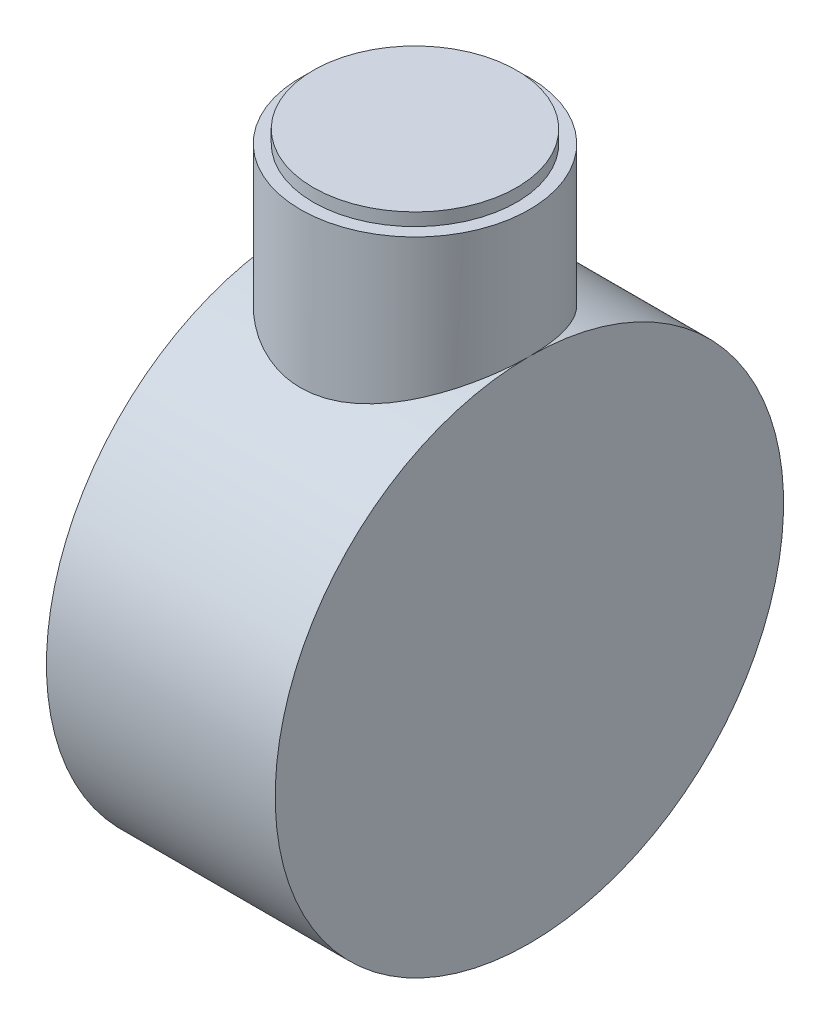
ISO-10303-21;
HEADER;
FILE_DESCRIPTION(('STEP AP214'),'2;1');
FILE_NAME('part.step','',(''),(''),'','','');
FILE_SCHEMA(('AUTOMOTIVE_DESIGN { 1 0 10303 214 1 1 1 1 }'));
ENDSEC;
DATA;
#1=APPLICATION_CONTEXT('core data for automotive mechanical design processes');
#2=APPLICATION_PROTOCOL_DEFINITION('international standard','automotive_design',2000,#1);
#3=PRODUCT_CONTEXT('',#1,'mechanical');
#4=PRODUCT('Part','Part','',(#3));
#5=PRODUCT_RELATED_PRODUCT_CATEGORY('part','',(#4));
#6=PRODUCT_DEFINITION_FORMATION('','',#4);
#7=PRODUCT_DEFINITION_CONTEXT('part definition',#1,'design');
#8=PRODUCT_DEFINITION('design','',#6,#7);
#9=PRODUCT_DEFINITION_SHAPE('','',#8);
#10=(LENGTH_UNIT() NAMED_UNIT(*) SI_UNIT(.MILLI.,.METRE.));
#11=(NAMED_UNIT(*) PLANE_ANGLE_UNIT() SI_UNIT($,.RADIAN.));
#12=(NAMED_UNIT(*) SI_UNIT($,.STERADIAN.) SOLID_ANGLE_UNIT());
#13=UNCERTAINTY_MEASURE_WITH_UNIT(LENGTH_MEASURE(1.E-05),#10,'distance_accuracy_value','');
#14=(GEOMETRIC_REPRESENTATION_CONTEXT(3) GLOBAL_UNCERTAINTY_ASSIGNED_CONTEXT((#13)) GLOBAL_UNIT_ASSIGNED_CONTEXT((#10,
#11,#12)) REPRESENTATION_CONTEXT('',''));
#15=CARTESIAN_POINT('',(0.,0.,0.));
#16=DIRECTION('',(0.,0.,1.));
#17=DIRECTION('',(1.,0.,0.));
#18=AXIS2_PLACEMENT_3D('',#15,#16,#17);
#19=CARTESIAN_POINT('',(90.,0.,0.));
#20=DIRECTION('',(-1.,0.,0.));
#21=DIRECTION('',(0.,0.,1.));
#22=AXIS2_PLACEMENT_3D('',#19,#20,#21);
#23=CYLINDRICAL_SURFACE('',#22,100.);
#24=CARTESIAN_POINT('',(90.,0.,0.));
#25=DIRECTION('',(1.,0.,0.));
#26=DIRECTION('',(0.,0.,-1.));
#27=AXIS2_PLACEMENT_3D('',#24,#25,#26);
#28=CIRCLE('',#27,100.);
#29=CARTESIAN_POINT('',(90.,100.,0.));
#30=VERTEX_POINT('',#29);
#31=EDGE_CURVE('E45',#30,#30,#28,.T.);
#32=ORIENTED_EDGE('',*,*,#31,.F.);
#33=CARTESIAN_POINT('',(45.,89.3028554974588,45.));
#34=CARTESIAN_POINT('',(46.1902179876641,89.3028681766187,44.9999882870826));
#35=CARTESIAN_POINT('',(47.3807590165683,89.3267336686042,44.952710688566));
#36=CARTESIAN_POINT('',(49.7529856043906,89.4213860731539,44.7641198896699));
#37=CARTESIAN_POINT('',(50.9346655940237,89.4922003414657,44.6227518652256));
#38=CARTESIAN_POINT('',(53.2823279584062,89.6784526674748,44.2472492611974));
#39=CARTESIAN_POINT('',(54.4482698101625,89.7939891245649,44.0129100945538));
#40=CARTESIAN_POINT('',(56.7532543700524,90.0656912591433,43.4542001375401));
#41=CARTESIAN_POINT('',(57.8923006223889,90.2218515504118,43.1298412822904));
#42=CARTESIAN_POINT('',(60.1313888934585,90.568986568982,42.3960194697545));
#43=CARTESIAN_POINT('',(61.2315849059444,90.7597995240651,41.9869507758954));
#44=CARTESIAN_POINT('',(62.8516117103104,91.0680979473647,41.3117725537762));
#45=CARTESIAN_POINT('',(63.3866097935658,91.1745515333548,41.0764333720673));
#46=CARTESIAN_POINT('',(64.4460401702507,91.3940914569124,40.5856177698904));
#47=CARTESIAN_POINT('',(64.9704703347301,91.5071791133437,40.3301373418151));
#48=CARTESIAN_POINT('',(66.5263137760091,91.855107826268,39.5344699257274));
#49=CARTESIAN_POINT('',(67.5408709534353,92.0987284910277,38.9648101041605));
#50=CARTESIAN_POINT('',(69.5198632774164,92.6029572250553,37.7508160334331));
#51=CARTESIAN_POINT('',(70.484294925552,92.8635664771567,37.1064765822548));
#52=CARTESIAN_POINT('',(71.9210396264115,93.2711784793098,36.0643694778765));
#53=CARTESIAN_POINT('',(72.4129426066666,93.4144320072647,35.6918870478075));
#54=CARTESIAN_POINT('',(73.3805436314261,93.7029458778116,34.9274225877787));
#55=CARTESIAN_POINT('',(73.8562453745625,93.84820575158,34.5354450593761));
#56=CARTESIAN_POINT('',(75.25841834782,94.2856461660323,33.3308635415595));
#57=CARTESIAN_POINT('',(76.1600057330652,94.5795013858027,32.4895754861222));
#58=CARTESIAN_POINT('',(77.8918920234839,95.1641298804072,30.7350589083855));
#59=CARTESIAN_POINT('',(78.7221618773997,95.4549018574002,29.821801356982));
#60=CARTESIAN_POINT('',(80.3063806361099,96.0260101979286,27.9281797551686));
#61=CARTESIAN_POINT('',(81.0603279034123,96.306346337483,26.9478142657221));
#62=CARTESIAN_POINT('',(82.524261156347,96.8637614488085,24.8721858792074));
#63=CARTESIAN_POINT('',(83.2298966005024,97.1399061602283,23.7735965358629));
#64=CARTESIAN_POINT('',(84.545482403952,97.6651491624709,21.5142652011043));
#65=CARTESIAN_POINT('',(85.1554284928385,97.9142462460644,20.3535204389281));
#66=CARTESIAN_POINT('',(86.2736591260209,98.3781283141212,17.9779769221208));
#67=CARTESIAN_POINT('',(86.7819841487128,98.5929269536849,16.763199926641));
#68=CARTESIAN_POINT('',(87.6918181754942,98.9819279219973,14.287995234868));
#69=CARTESIAN_POINT('',(88.093336077774,99.1561336324266,13.0275713514014));
#70=CARTESIAN_POINT('',(88.7642307572017,99.4495978064333,10.547187898016));
#71=CARTESIAN_POINT('',(89.0400483260075,99.5715088460817,9.32928274632695));
#72=CARTESIAN_POINT('',(89.4898529315421,99.7712698460038,6.87122907730538));
#73=CARTESIAN_POINT('',(89.6638436691689,99.8491214076167,5.63108137006757));
#74=CARTESIAN_POINT('',(89.9078287407437,99.9584973130483,3.13906697603708));
#75=CARTESIAN_POINT('',(89.9778652040721,99.9900404241612,1.88720524367051));
#76=CARTESIAN_POINT('',(90.0131888061469,100.005934040019,-0.618269410461868));
#77=CARTESIAN_POINT('',(89.9784808420073,99.9902867510562,-1.87188224761934));
#78=CARTESIAN_POINT('',(89.8109438423947,99.9150426330293,-4.28173796060049));
#79=CARTESIAN_POINT('',(89.6852433922797,99.8586392864868,-5.43858477458151));
#80=CARTESIAN_POINT('',(89.3451823375733,99.7069306539256,-7.73651652953792));
#81=CARTESIAN_POINT('',(89.1308267613055,99.6116275742182,-8.87760236064904));
#82=CARTESIAN_POINT('',(88.615633238685,99.3844559121302,-11.1363617041543));
#83=CARTESIAN_POINT('',(88.3147924107068,99.2525861113783,-12.2540344351095));
#84=CARTESIAN_POINT('',(87.6294954022887,98.9554374590341,-14.4588724139199));
#85=CARTESIAN_POINT('',(87.2450365169259,98.7901575266846,-15.5460366735855));
#86=CARTESIAN_POINT('',(86.3894431679988,98.4273015368164,-17.6996263814685));
#87=CARTESIAN_POINT('',(85.9170854705278,98.2292747319281,-18.7654892944469));
#88=CARTESIAN_POINT('',(84.8935246062402,97.8073409830481,-20.8532600424713));
#89=CARTESIAN_POINT('',(84.342321334628,97.5834340046584,-21.8751678190932));
#90=CARTESIAN_POINT('',(83.1648822779764,97.1147082876599,-23.8701421952837));
#91=CARTESIAN_POINT('',(82.5386254129761,96.8698836795807,-24.8431949637687));
#92=CARTESIAN_POINT('',(81.2152354408762,96.3647715736837,-26.7355604417647));
#93=CARTESIAN_POINT('',(80.5180988463561,96.1044833152864,-27.6548705035215));
#94=CARTESIAN_POINT('',(78.9981129026742,95.5527647205584,-29.5072216548636));
#95=CARTESIAN_POINT('',(78.1696647122992,95.2605115019662,-30.4354442849367));
#96=CARTESIAN_POINT('',(76.8723365666782,94.8191992147416,-31.7732640147984));
#97=CARTESIAN_POINT('',(76.4307536596736,94.671596558442,-32.2101451985714));
#98=CARTESIAN_POINT('',(75.5297841179616,94.3763027731307,-33.0653613740368));
#99=CARTESIAN_POINT('',(75.0703931822234,94.2286116313352,-33.4836918323539));
#100=CARTESIAN_POINT('',(73.6662490600945,93.7868015471155,-34.7100988920166));
#101=CARTESIAN_POINT('',(72.6956936902944,93.4940040701853,-35.4894167888364));
#102=CARTESIAN_POINT('',(70.6911090223773,92.9199189719115,-36.966426979104));
#103=CARTESIAN_POINT('',(69.6570809006477,92.6386311374121,-37.6641207846556));
#104=CARTESIAN_POINT('',(68.0393573442874,92.2253980481055,-38.660222343702));
#105=CARTESIAN_POINT('',(67.4766321618228,92.0863302328081,-38.9900916839873));
#106=CARTESIAN_POINT('',(66.3362809034721,91.814652231201,-39.625610620258));
#107=CARTESIAN_POINT('',(65.7586583312565,91.6820405473024,-39.9312658434601));
#108=CARTESIAN_POINT('',(64.5892011834318,91.4243486570051,-40.5177878028122));
#109=CARTESIAN_POINT('',(63.9973646069778,91.2992695197262,-40.7986510227718));
#110=CARTESIAN_POINT('',(62.8005269709551,91.0577561868573,-41.3348693902788));
#111=CARTESIAN_POINT('',(62.19552513126,90.9413225053798,-41.590223021179));
#112=CARTESIAN_POINT('',(60.3631743301642,90.606772872615,-42.3166341614614));
#113=CARTESIAN_POINT('',(59.117331718123,90.403151906337,-42.7486185844777));
#114=CARTESIAN_POINT('',(56.5864878153477,90.0426469885239,-43.5028374111287));
#115=CARTESIAN_POINT('',(55.3014907436605,89.8857580209257,-43.8250835942465));
#116=CARTESIAN_POINT('',(52.796137503282,89.6344791058606,-44.3366140110802));
#117=CARTESIAN_POINT('',(51.5777611211628,89.5364116847214,-44.5337811498723));
#118=CARTESIAN_POINT('',(49.1259852315813,89.3897467888991,-44.8274510150713));
#119=CARTESIAN_POINT('',(47.8925864636185,89.3411468889841,-44.9239586764913));
#120=CARTESIAN_POINT('',(45.4215597569296,89.2953095384928,-45.0150008184263));
#121=CARTESIAN_POINT('',(44.1839336635366,89.298051981367,-45.0095752177674));
#122=CARTESIAN_POINT('',(41.7145422847981,89.3547467653986,-44.8969178762584));
#123=CARTESIAN_POINT('',(40.4827767576284,89.4086969748293,-44.789690373317));
#124=CARTESIAN_POINT('',(38.1336393031109,89.5593910715347,-44.4875393353906));
#125=CARTESIAN_POINT('',(37.0150181201882,89.6523544455239,-44.3003416710012));
#126=CARTESIAN_POINT('',(34.7988792901504,89.876847433839,-43.8430963865714));
#127=CARTESIAN_POINT('',(33.7013602845873,90.0083745567146,-43.5730541187387));
#128=CARTESIAN_POINT('',(31.5338915220606,90.3060529107227,-42.9527064790144));
#129=CARTESIAN_POINT('',(30.4639470425921,90.4722107153383,-42.6023858676911));
#130=CARTESIAN_POINT('',(28.3577084711749,90.8344057245852,-41.8245697514426));
#131=CARTESIAN_POINT('',(27.3214161543964,91.0304445023585,-41.3970701830617));
#132=CARTESIAN_POINT('',(25.2418198451648,91.4565667463621,-40.4472408060479));
#133=CARTESIAN_POINT('',(24.2003049996581,91.6877864182297,-39.9215052908615));
#134=CARTESIAN_POINT('',(22.1648398730859,92.1708565169651,-38.7931656290451));
#135=CARTESIAN_POINT('',(21.1708904504715,92.4227073159571,-38.1905600957996));
#136=CARTESIAN_POINT('',(19.2347132084501,92.940730687222,-36.9120087801893));
#137=CARTESIAN_POINT('',(18.292505942255,93.2069088687194,-36.2360341667197));
#138=CARTESIAN_POINT('',(16.4643814478034,93.7471001570811,-34.814641475257));
#139=CARTESIAN_POINT('',(15.5784671705436,94.0211136736003,-34.0692197617446));
#140=CARTESIAN_POINT('',(13.7830344083664,94.5976053502752,-32.4363087629468));
#141=CARTESIAN_POINT('',(12.879705419112,94.9002423638059,-31.5420557358247));
#142=CARTESIAN_POINT('',(11.150902534718,95.4992342292844,-29.6791767989224));
#143=CARTESIAN_POINT('',(10.3254335750042,95.7955886820685,-28.7105461815135));
#144=CARTESIAN_POINT('',(8.75749908949235,96.3742071741682,-26.7039786340705));
#145=CARTESIAN_POINT('',(8.01504893358561,96.6564685990002,-25.6660289271033));
#146=CARTESIAN_POINT('',(6.61872516582838,97.1993231806131,-23.5267753587512));
#147=CARTESIAN_POINT('',(5.96484986784847,97.4599167498314,-22.4254727039349));
#148=CARTESIAN_POINT('',(4.74496192734621,97.9548572876452,-20.1546425810267));
#149=CARTESIAN_POINT('',(4.1799001981782,98.1889135804228,-18.984539843915));
#150=CARTESIAN_POINT('',(3.15111638806697,98.6210475970088,-16.5940939315919));
#151=CARTESIAN_POINT('',(2.68739619637579,98.8191246500653,-15.3737498202635));
#152=CARTESIAN_POINT('',(1.86661095286718,99.1733441317279,-12.8925252514561));
#153=CARTESIAN_POINT('',(1.50948432979567,99.3295107636184,-11.6316686631103));
#154=CARTESIAN_POINT('',(0.905870988387183,99.5952739769533,-9.07895701643269));
#155=CARTESIAN_POINT('',(0.659374192849456,99.7048747999992,-7.78710479277117));
#156=CARTESIAN_POINT('',(0.295200060392052,99.8673868654933,-5.2866449690379));
#157=CARTESIAN_POINT('',(0.168874455452138,99.9240969107407,-4.07953685073905));
#158=CARTESIAN_POINT('',(0.0141855795090079,99.9935929135836,-1.65782276352291));
#159=CARTESIAN_POINT('',(-0.0141831234380263,100.006381306739,-0.443217214097942));
#160=CARTESIAN_POINT('',(0.0273680157498346,99.987685838317,1.98370635667432));
#161=CARTESIAN_POINT('',(0.0972678590673821,99.9562109848354,3.19602479320252));
#162=CARTESIAN_POINT('',(0.334496009520187,99.8498673103295,5.60914847648842));
#163=CARTESIAN_POINT('',(0.501823063834113,99.7749990473031,6.80995387109107));
#164=CARTESIAN_POINT('',(0.92199012404988,99.5883395402089,9.13564921913103));
#165=CARTESIAN_POINT('',(1.17050192813986,99.4784227770087,10.2614763094785));
#166=CARTESIAN_POINT('',(1.75190808043215,99.2236322670055,12.4870032284318));
#167=CARTESIAN_POINT('',(2.08479899040331,99.078759944563,13.5867041196165));
#168=CARTESIAN_POINT('',(2.83196899993634,98.7574257480783,15.7534327400958));
#169=CARTESIAN_POINT('',(3.24625681849007,98.5809604900759,16.8204569549979));
#170=CARTESIAN_POINT('',(4.15276146649127,98.2004466100145,18.9157686393316));
#171=CARTESIAN_POINT('',(4.64498170904348,97.9963967799272,19.9440544097431));
#172=CARTESIAN_POINT('',(5.72791394667864,97.5553233754977,22.002661332586));
#173=CARTESIAN_POINT('',(6.32210279189852,97.3172180470437,23.0309214419204));
#174=CARTESIAN_POINT('',(7.58737129782853,96.8213101571901,25.0339499997705));
#175=CARTESIAN_POINT('',(8.25845271460335,96.5635071459817,26.008717225869));
#176=CARTESIAN_POINT('',(9.67346637218239,96.0340221402465,27.900388810884));
#177=CARTESIAN_POINT('',(10.4174244085749,95.7623352477416,28.8172724909784));
#178=CARTESIAN_POINT('',(11.9737827997513,95.2113510620483,30.5885448779132));
#179=CARTESIAN_POINT('',(12.7861861004833,94.9320534416375,31.4429308918359));
#180=CARTESIAN_POINT('',(14.5437439801074,94.3495714200108,33.1517393272663));
#181=CARTESIAN_POINT('',(15.4943212309368,94.0462845952145,34.0005594988777));
#182=CARTESIAN_POINT('',(17.465391284984,93.4466336611205,35.6155708428455));
#183=CARTESIAN_POINT('',(18.4858887469231,93.1502700148755,36.3817565005659));
#184=CARTESIAN_POINT('',(20.5920583003244,92.5727912267688,37.827033568595));
#185=CARTESIAN_POINT('',(21.6777753351969,92.2916868601518,38.5060638847619));
#186=CARTESIAN_POINT('',(23.9076283139157,91.753569446625,39.771286804731));
#187=CARTESIAN_POINT('',(25.0517607999162,91.4965549762853,40.3574848952404));
#188=CARTESIAN_POINT('',(27.3991548519052,91.01353708524,41.4353406741124));
#189=CARTESIAN_POINT('',(28.6027353788997,90.7877330359671,41.9263979461179));
#190=CARTESIAN_POINT('',(30.4410578350067,90.4798145072509,42.5847577559935));
#191=CARTESIAN_POINT('',(31.0594823957773,90.3822857595567,42.7912150994658));
#192=CARTESIAN_POINT('',(32.3062165327077,90.1984053275562,43.1774652817225));
#193=CARTESIAN_POINT('',(32.9345249068764,90.1120522957545,43.3572613355342));
#194=CARTESIAN_POINT('',(34.1980116693047,89.9516055606048,43.6891580032824));
#195=CARTESIAN_POINT('',(34.8331654046282,89.8774776534002,43.841336012159));
#196=CARTESIAN_POINT('',(36.1107229005555,89.741940542164,44.1181126394092));
#197=CARTESIAN_POINT('',(36.7531257480597,89.680529754729,44.2427146913868));
#198=CARTESIAN_POINT('',(38.0434713373538,89.5710907679732,44.4638608257593));
#199=CARTESIAN_POINT('',(38.6914104608301,89.5230544282506,44.560421976887));
#200=CARTESIAN_POINT('',(39.9916728839784,89.4408318800783,44.7252285915255));
#201=CARTESIAN_POINT('',(40.6439956108916,89.4066438966535,44.7934776838839));
#202=CARTESIAN_POINT('',(41.9130797446531,89.3540778429853,44.8982408423979));
#203=CARTESIAN_POINT('',(42.5296725657306,89.3348871447545,44.9363873902777));
#204=CARTESIAN_POINT('',(43.7641478694953,89.3092724769462,44.9872704148073));
#205=CARTESIAN_POINT('',(44.3820303926661,89.3028489143492,45.0000060814297));
#206=CARTESIAN_POINT('',(45.,89.3028554974588,45.));
#207=B_SPLINE_CURVE_WITH_KNOTS('',3,(#33,#34,#35,#36,#37,#38,#39,#40,#41,#42,#43,#44,#45,#46,
#47,#48,#49,#50,#51,#52,#53,#54,#55,#56,#57,#58,#59,#60,#61,#62,#63,#64,#65,#66,#67,#68,#69,#70,
#71,#72,#73,#74,#75,#76,#77,#78,#79,#80,#81,#82,#83,#84,#85,#86,#87,#88,#89,#90,#91,#92,#93,#94,
#95,#96,#97,#98,#99,#100,#101,#102,#103,#104,#105,#106,#107,#108,#109,#110,#111,#112,#113,#114,
#115,#116,#117,#118,#119,#120,#121,#122,#123,#124,#125,#126,#127,#128,#129,#130,#131,#132,#133,
#134,#135,#136,#137,#138,#139,#140,#141,#142,#143,#144,#145,#146,#147,#148,#149,#150,#151,#152,
#153,#154,#155,#156,#157,#158,#159,#160,#161,#162,#163,#164,#165,#166,#167,#168,#169,#170,#171,
#172,#173,#174,#175,#176,#177,#178,#179,#180,#181,#182,#183,#184,#185,#186,#187,#188,#189,#190,
#191,#192,#193,#194,#195,#196,#197,#198,#199,#200,#201,#202,#203,#204,#205,#206),.UNSPECIFIED.,
.T.,.F.,(4,2,2,2,2,2,2,2,2,2,2,2,2,2,2,2,2,2,2,2,2,2,2,2,2,2,2,2,2,2,2,2,2,2,2,2,2,2,2,2,2,2,2,
2,2,2,2,2,2,2,2,2,2,2,2,2,2,2,2,2,2,2,2,2,2,2,2,2,2,2,2,2,2,2,2,2,2,2,2,2,2,2,2,2,2,2,4),(0.,
3.57004456202138,7.142171120163,10.7222022905754,14.301759034694,17.8650155954565,
19.6468748007691,21.429089450966,24.9915730731885,28.5543049994472,30.4541350488814,
32.3535284324605,36.1521315115217,39.9522746884023,43.7524993796221,47.7511384509943,
51.7499559221978,55.7471773694565,59.7440657004986,63.5031454076992,67.262088482591,
71.0195077603716,74.7767513703323,78.2677037267603,81.7584581112018,85.2493288185145,
88.740312467232,92.2841073272258,95.8279068974077,99.3727041414043,102.917675880807,
106.747130549034,108.662110131449,110.577555141006,114.409192307224,118.240758480306,
120.24104680859,122.240868909723,124.240974186637,126.241198307132,130.237729916121,
134.233832395511,137.943130247698,141.652246236296,145.3599097013,149.067418826849,
152.477481200431,155.887323311993,159.297813259118,162.708482820202,166.272876686499,
169.837334858009,173.403198824757,176.969249567623,180.884639850309,184.800278156911,
188.716640198776,192.632927677479,196.588645591191,200.544437242789,204.497939483112,
208.451081528299,212.091488999004,215.731694597191,219.371159477498,223.01057755878,
226.481121151649,229.951523351536,233.422297493331,236.893223682164,240.523016196808,
244.152891624813,247.784056567327,251.415377878486,255.340824990902,259.266533907184,
263.19497980987,267.123193441028,271.075442850258,273.052554708579,275.029427957034,
277.000672799546,278.971672055393,280.941469020353,282.91101343204,284.764546764256,
286.618139180958),.UNSPECIFIED.);
#208=CARTESIAN_POINT('',(0.,100.,0.));
#209=VERTEX_POINT('',#208);
#210=EDGE_CURVE('E52',#209,#30,#207,.T.);
#211=ORIENTED_EDGE('',*,*,#210,.F.);
#212=CARTESIAN_POINT('',(0.,0.,0.));
#213=DIRECTION('',(1.,0.,0.));
#214=DIRECTION('',(0.,0.,-1.));
#215=AXIS2_PLACEMENT_3D('',#212,#213,#214);
#216=CIRCLE('',#215,100.);
#217=EDGE_CURVE('E40',#209,#209,#216,.T.);
#218=ORIENTED_EDGE('',*,*,#217,.T.);
#219=EDGE_CURVE('E54',#30,#209,#207,.T.);
#220=ORIENTED_EDGE('',*,*,#219,.F.);
#221=EDGE_LOOP('',(#32,#211,#218,#220));
#222=FACE_BOUND('',#221,.T.);
#223=ADVANCED_FACE('F37',(#222),#23,.T.);
#224=CARTESIAN_POINT('',(90.,0.,0.));
#225=DIRECTION('',(1.,0.,0.));
#226=DIRECTION('',(0.,0.,-1.));
#227=AXIS2_PLACEMENT_3D('',#224,#225,#226);
#228=PLANE('',#227);
#229=ORIENTED_EDGE('',*,*,#31,.T.);
#230=EDGE_LOOP('',(#229));
#231=FACE_BOUND('',#230,.T.);
#232=ADVANCED_FACE('F87',(#231),#228,.T.);
#233=CARTESIAN_POINT('',(0.,0.,0.));
#234=DIRECTION('',(1.,0.,0.));
#235=DIRECTION('',(0.,0.,-1.));
#236=AXIS2_PLACEMENT_3D('',#233,#234,#235);
#237=PLANE('',#236);
#238=ORIENTED_EDGE('',*,*,#217,.F.);
#239=EDGE_LOOP('',(#238));
#240=FACE_BOUND('',#239,.T.);
#241=ADVANCED_FACE('F80',(#240),#237,.F.);
#242=CARTESIAN_POINT('',(45.,150.,0.));
#243=DIRECTION('',(0.,1.,0.));
#244=DIRECTION('',(0.,0.,1.));
#245=AXIS2_PLACEMENT_3D('',#242,#243,#244);
#246=PLANE('',#245);
#247=CARTESIAN_POINT('',(45.,150.,0.));
#248=DIRECTION('',(0.,1.,0.));
#249=DIRECTION('',(0.,0.,1.));
#250=AXIS2_PLACEMENT_3D('',#247,#248,#249);
#251=CIRCLE('',#250,40.);
#252=CARTESIAN_POINT('',(45.,150.,40.));
#253=VERTEX_POINT('',#252);
#254=EDGE_CURVE('E11',#253,#253,#251,.T.);
#255=ORIENTED_EDGE('',*,*,#254,.F.);
#256=EDGE_LOOP('',(#255));
#257=FACE_BOUND('',#256,.T.);
#258=CARTESIAN_POINT('',(45.,150.,0.));
#259=DIRECTION('',(0.,1.,0.));
#260=DIRECTION('',(0.,0.,1.));
#261=AXIS2_PLACEMENT_3D('',#258,#259,#260);
#262=CIRCLE('',#261,45.);
#263=CARTESIAN_POINT('',(45.,150.,45.));
#264=VERTEX_POINT('',#263);
#265=EDGE_CURVE('E62',#264,#264,#262,.T.);
#266=ORIENTED_EDGE('',*,*,#265,.T.);
#267=EDGE_LOOP('',(#266));
#268=FACE_BOUND('',#267,.T.);
#269=ADVANCED_FACE('F78',(#257,#268),#246,.T.);
#270=CARTESIAN_POINT('',(45.,-100.001,0.));
#271=DIRECTION('',(0.,1.,0.));
#272=DIRECTION('',(0.,0.,1.));
#273=AXIS2_PLACEMENT_3D('',#270,#271,#272);
#274=CYLINDRICAL_SURFACE('',#273,45.);
#275=ORIENTED_EDGE('',*,*,#265,.F.);
#276=EDGE_LOOP('',(#275));
#277=FACE_BOUND('',#276,.T.);
#278=ORIENTED_EDGE('',*,*,#219,.T.);
#279=ORIENTED_EDGE('',*,*,#210,.T.);
#280=EDGE_LOOP('',(#278,#279));
#281=FACE_BOUND('',#280,.T.);
#282=ADVANCED_FACE('F55',(#277,#281),#274,.T.);
#283=CARTESIAN_POINT('',(45.,155.,0.));
#284=DIRECTION('',(0.,-1.,0.));
#285=DIRECTION('',(0.,0.,-1.));
#286=AXIS2_PLACEMENT_3D('',#283,#284,#285);
#287=CYLINDRICAL_SURFACE('',#286,40.);
#288=CARTESIAN_POINT('',(45.,155.,0.));
#289=DIRECTION('',(0.,1.,0.));
#290=DIRECTION('',(0.,0.,1.));
#291=AXIS2_PLACEMENT_3D('',#288,#289,#290);
#292=CIRCLE('',#291,40.);
#293=CARTESIAN_POINT('',(45.,155.,40.));
#294=VERTEX_POINT('',#293);
#295=EDGE_CURVE('E64',#294,#294,#292,.T.);
#296=ORIENTED_EDGE('',*,*,#295,.F.);
#297=EDGE_LOOP('',(#296));
#298=FACE_BOUND('',#297,.T.);
#299=ORIENTED_EDGE('',*,*,#254,.T.);
#300=EDGE_LOOP('',(#299));
#301=FACE_BOUND('',#300,.T.);
#302=ADVANCED_FACE('F76',(#298,#301),#287,.T.);
#303=CARTESIAN_POINT('',(45.,155.,0.));
#304=DIRECTION('',(0.,1.,0.));
#305=DIRECTION('',(0.,0.,1.));
#306=AXIS2_PLACEMENT_3D('',#303,#304,#305);
#307=PLANE('',#306);
#308=ORIENTED_EDGE('',*,*,#295,.T.);
#309=EDGE_LOOP('',(#308));
#310=FACE_BOUND('',#309,.T.);
#311=ADVANCED_FACE('F124',(#310),#307,.T.);
#312=CLOSED_SHELL('',(#223,#232,#241,#269,#282,#302,#311));
#313=MANIFOLD_SOLID_BREP('B2',#312);
#314=ADVANCED_BREP_SHAPE_REPRESENTATION('',(#18,#313),#14);
#315=SHAPE_DEFINITION_REPRESENTATION(#9,#314);
ENDSEC;
END-ISO-10303-21;
